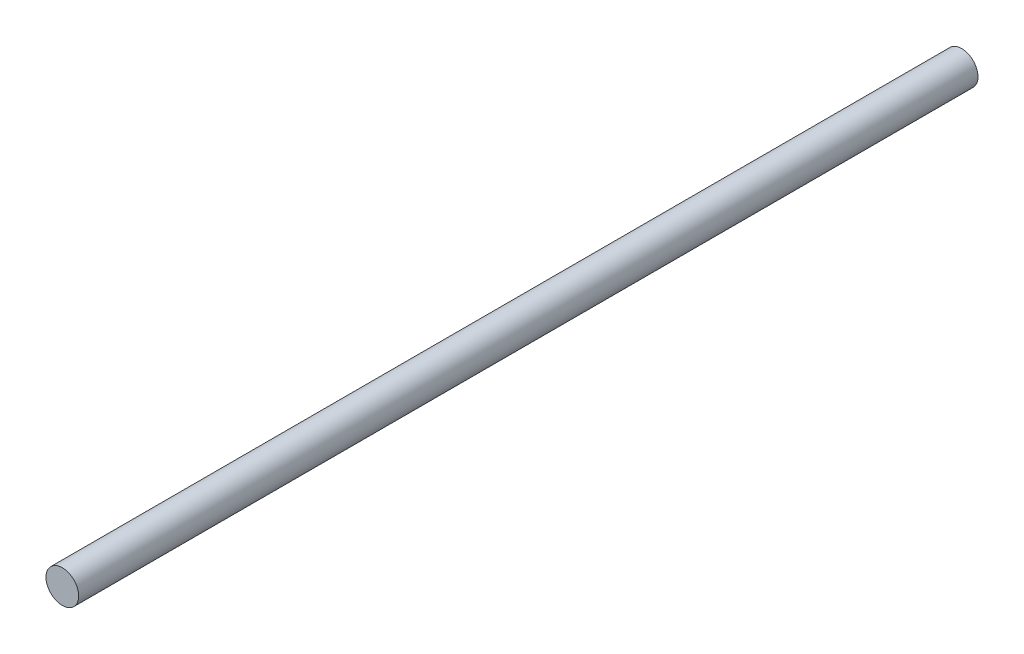
ISO-10303-21;
HEADER;
FILE_DESCRIPTION(('STEP AP214'),'2;1');
FILE_NAME('part.step','',(''),(''),'','','');
FILE_SCHEMA(('AUTOMOTIVE_DESIGN { 1 0 10303 214 1 1 1 1 }'));
ENDSEC;
DATA;
#1=APPLICATION_CONTEXT('core data for automotive mechanical design processes');
#2=APPLICATION_PROTOCOL_DEFINITION('international standard','automotive_design',2000,#1);
#3=PRODUCT_CONTEXT('',#1,'mechanical');
#4=PRODUCT('Part','Part','',(#3));
#5=PRODUCT_RELATED_PRODUCT_CATEGORY('part','',(#4));
#6=PRODUCT_DEFINITION_FORMATION('','',#4);
#7=PRODUCT_DEFINITION_CONTEXT('part definition',#1,'design');
#8=PRODUCT_DEFINITION('design','',#6,#7);
#9=PRODUCT_DEFINITION_SHAPE('','',#8);
#10=(LENGTH_UNIT() NAMED_UNIT(*) SI_UNIT(.MILLI.,.METRE.));
#11=(NAMED_UNIT(*) PLANE_ANGLE_UNIT() SI_UNIT($,.RADIAN.));
#12=(NAMED_UNIT(*) SI_UNIT($,.STERADIAN.) SOLID_ANGLE_UNIT());
#13=UNCERTAINTY_MEASURE_WITH_UNIT(LENGTH_MEASURE(1.E-05),#10,'distance_accuracy_value','');
#14=(GEOMETRIC_REPRESENTATION_CONTEXT(3) GLOBAL_UNCERTAINTY_ASSIGNED_CONTEXT((#13)) GLOBAL_UNIT_ASSIGNED_CONTEXT((#10,
#11,#12)) REPRESENTATION_CONTEXT('',''));
#15=CARTESIAN_POINT('',(0.,0.,0.));
#16=DIRECTION('',(0.,0.,1.));
#17=DIRECTION('',(1.,0.,0.));
#18=AXIS2_PLACEMENT_3D('',#15,#16,#17);
#19=CARTESIAN_POINT('',(0.,0.,220.));
#20=DIRECTION('',(0.,0.,-1.));
#21=DIRECTION('',(-1.,0.,0.));
#22=AXIS2_PLACEMENT_3D('',#19,#20,#21);
#23=CYLINDRICAL_SURFACE('',#22,4.);
#24=CARTESIAN_POINT('',(0.,0.,220.));
#25=DIRECTION('',(0.,0.,1.));
#26=DIRECTION('',(1.,0.,0.));
#27=AXIS2_PLACEMENT_3D('',#24,#25,#26);
#28=CIRCLE('',#27,4.);
#29=CARTESIAN_POINT('',(4.,0.,220.));
#30=VERTEX_POINT('',#29);
#31=EDGE_CURVE('E10',#30,#30,#28,.T.);
#32=ORIENTED_EDGE('',*,*,#31,.F.);
#33=EDGE_LOOP('',(#32));
#34=FACE_BOUND('',#33,.T.);
#35=CARTESIAN_POINT('',(0.,0.,0.));
#36=DIRECTION('',(0.,0.,1.));
#37=DIRECTION('',(1.,0.,0.));
#38=AXIS2_PLACEMENT_3D('',#35,#36,#37);
#39=CIRCLE('',#38,4.);
#40=CARTESIAN_POINT('',(4.,0.,0.));
#41=VERTEX_POINT('',#40);
#42=EDGE_CURVE('E39',#41,#41,#39,.T.);
#43=ORIENTED_EDGE('',*,*,#42,.T.);
#44=EDGE_LOOP('',(#43));
#45=FACE_BOUND('',#44,.T.);
#46=ADVANCED_FACE('F36',(#34,#45),#23,.T.);
#47=CARTESIAN_POINT('',(0.,0.,220.));
#48=DIRECTION('',(0.,0.,1.));
#49=DIRECTION('',(1.,0.,0.));
#50=AXIS2_PLACEMENT_3D('',#47,#48,#49);
#51=PLANE('',#50);
#52=ORIENTED_EDGE('',*,*,#31,.T.);
#53=EDGE_LOOP('',(#52));
#54=FACE_BOUND('',#53,.T.);
#55=ADVANCED_FACE('F51',(#54),#51,.T.);
#56=CARTESIAN_POINT('',(0.,0.,0.));
#57=DIRECTION('',(0.,0.,1.));
#58=DIRECTION('',(1.,0.,0.));
#59=AXIS2_PLACEMENT_3D('',#56,#57,#58);
#60=PLANE('',#59);
#61=ORIENTED_EDGE('',*,*,#42,.F.);
#62=EDGE_LOOP('',(#61));
#63=FACE_BOUND('',#62,.T.);
#64=ADVANCED_FACE('F49',(#63),#60,.F.);
#65=CLOSED_SHELL('',(#46,#55,#64));
#66=MANIFOLD_SOLID_BREP('B2',#65);
#67=ADVANCED_BREP_SHAPE_REPRESENTATION('',(#18,#66),#14);
#68=SHAPE_DEFINITION_REPRESENTATION(#9,#67);
ENDSEC;
END-ISO-10303-21;
